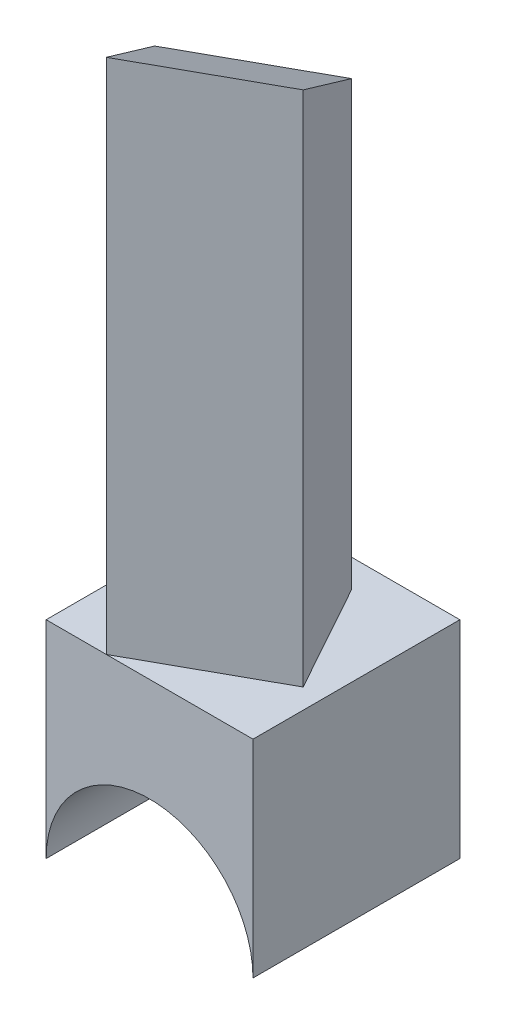
ISO-10303-21;
HEADER;
FILE_DESCRIPTION(('STEP AP214'),'2;1');
FILE_NAME('part.step','',(''),(''),'','','');
FILE_SCHEMA(('AUTOMOTIVE_DESIGN { 1 0 10303 214 1 1 1 1 }'));
ENDSEC;
DATA;
#1=APPLICATION_CONTEXT('core data for automotive mechanical design processes');
#2=APPLICATION_PROTOCOL_DEFINITION('international standard','automotive_design',2000,#1);
#3=PRODUCT_CONTEXT('',#1,'mechanical');
#4=PRODUCT('Part','Part','',(#3));
#5=PRODUCT_RELATED_PRODUCT_CATEGORY('part','',(#4));
#6=PRODUCT_DEFINITION_FORMATION('','',#4);
#7=PRODUCT_DEFINITION_CONTEXT('part definition',#1,'design');
#8=PRODUCT_DEFINITION('design','',#6,#7);
#9=PRODUCT_DEFINITION_SHAPE('','',#8);
#10=(LENGTH_UNIT() NAMED_UNIT(*) SI_UNIT(.MILLI.,.METRE.));
#11=(NAMED_UNIT(*) PLANE_ANGLE_UNIT() SI_UNIT($,.RADIAN.));
#12=(NAMED_UNIT(*) SI_UNIT($,.STERADIAN.) SOLID_ANGLE_UNIT());
#13=UNCERTAINTY_MEASURE_WITH_UNIT(LENGTH_MEASURE(1.E-05),#10,'distance_accuracy_value','');
#14=(GEOMETRIC_REPRESENTATION_CONTEXT(3) GLOBAL_UNCERTAINTY_ASSIGNED_CONTEXT((#13)) GLOBAL_UNIT_ASSIGNED_CONTEXT((#10,
#11,#12)) REPRESENTATION_CONTEXT('',''));
#15=CARTESIAN_POINT('',(0.,0.,0.));
#16=DIRECTION('',(0.,0.,1.));
#17=DIRECTION('',(1.,0.,0.));
#18=AXIS2_PLACEMENT_3D('',#15,#16,#17);
#19=CARTESIAN_POINT('',(-50.,50.,-100.));
#20=DIRECTION('',(0.,-1.,0.));
#21=DIRECTION('',(0.,0.,1.));
#22=AXIS2_PLACEMENT_3D('',#19,#20,#21);
#23=PLANE('',#22);
#24=DIRECTION('',(0.484809620246331,0.,0.874619707139399));
#25=VECTOR('',#24,1.);
#26=CARTESIAN_POINT('',(40.3119567145378,50.,-33.9366734172432));
#27=LINE('',#26,#25);
#28=CARTESIAN_POINT('',(11.223379499758,50.,-86.4138558456071));
#29=VERTEX_POINT('',#28);
#30=CARTESIAN_POINT('',(40.3119567145378,50.,-33.9366734172432));
#31=VERTEX_POINT('',#30);
#32=EDGE_CURVE('E111',#29,#31,#27,.T.);
#33=ORIENTED_EDGE('',*,*,#32,.T.);
#34=DIRECTION('',(-0.874619707139399,0.,0.484809620246332));
#35=VECTOR('',#34,1.);
#36=CARTESIAN_POINT('',(-20.9114227852201,50.,0.));
#37=LINE('',#36,#35);
#38=CARTESIAN_POINT('',(-20.9114227852201,50.,0.));
#39=VERTEX_POINT('',#38);
#40=EDGE_CURVE('E167',#31,#39,#37,.T.);
#41=ORIENTED_EDGE('',*,*,#40,.T.);
#42=DIRECTION('',(-1.,0.,0.));
#43=VECTOR('',#42,1.);
#44=CARTESIAN_POINT('',(-50.,50.,0.));
#45=LINE('',#44,#43);
#46=CARTESIAN_POINT('',(50.,50.,0.));
#47=VERTEX_POINT('',#46);
#48=EDGE_CURVE('E149',#47,#39,#45,.T.);
#49=ORIENTED_EDGE('',*,*,#48,.F.);
#50=DIRECTION('',(0.,0.,1.));
#51=VECTOR('',#50,1.);
#52=CARTESIAN_POINT('',(50.,50.,-100.));
#53=LINE('',#52,#51);
#54=CARTESIAN_POINT('',(50.,50.,-100.));
#55=VERTEX_POINT('',#54);
#56=EDGE_CURVE('E45',#55,#47,#53,.T.);
#57=ORIENTED_EDGE('',*,*,#56,.F.);
#58=DIRECTION('',(-1.,0.,0.));
#59=VECTOR('',#58,1.);
#60=CARTESIAN_POINT('',(-50.,50.,-100.));
#61=LINE('',#60,#59);
#62=CARTESIAN_POINT('',(-50.,50.,-100.));
#63=VERTEX_POINT('',#62);
#64=EDGE_CURVE('E138',#55,#63,#61,.T.);
#65=ORIENTED_EDGE('',*,*,#64,.T.);
#66=DIRECTION('',(0.,0.,1.));
#67=VECTOR('',#66,1.);
#68=CARTESIAN_POINT('',(-50.,50.,-100.));
#69=LINE('',#68,#67);
#70=CARTESIAN_POINT('',(-50.,50.,-52.477182428364));
#71=VERTEX_POINT('',#70);
#72=EDGE_CURVE('E156',#63,#71,#69,.T.);
#73=ORIENTED_EDGE('',*,*,#72,.T.);
#74=DIRECTION('',(0.874619707139399,0.,-0.484809620246331));
#75=VECTOR('',#74,1.);
#76=CARTESIAN_POINT('',(11.223379499758,50.,-86.4138558456071));
#77=LINE('',#76,#75);
#78=EDGE_CURVE('E122',#71,#29,#77,.T.);
#79=ORIENTED_EDGE('',*,*,#78,.T.);
#80=EDGE_LOOP('',(#33,#41,#49,#57,#65,#73,#79));
#81=FACE_BOUND('',#80,.T.);
#82=ADVANCED_FACE('F37',(#81),#23,.F.);
#83=DIRECTION('',(-0.484809620246331,0.,-0.874619707139399));
#84=VECTOR('',#83,1.);
#85=CARTESIAN_POINT('',(-20.9114227852201,50.,0.));
#86=LINE('',#85,#84);
#87=EDGE_CURVE('E184',#39,#71,#86,.T.);
#88=ORIENTED_EDGE('',*,*,#87,.T.);
#89=CARTESIAN_POINT('',(-50.,50.,0.));
#90=VERTEX_POINT('',#89);
#91=EDGE_CURVE('E155',#71,#90,#69,.T.);
#92=ORIENTED_EDGE('',*,*,#91,.T.);
#93=EDGE_CURVE('E148',#39,#90,#45,.T.);
#94=ORIENTED_EDGE('',*,*,#93,.F.);
#95=EDGE_LOOP('',(#88,#92,#94));
#96=FACE_BOUND('',#95,.T.);
#97=ADVANCED_FACE('F185',(#96),#23,.F.);
#98=CARTESIAN_POINT('',(0.,-50.,-100.));
#99=DIRECTION('',(0.,0.,1.));
#100=DIRECTION('',(-1.,0.,0.));
#101=AXIS2_PLACEMENT_3D('',#98,#99,#100);
#102=CYLINDRICAL_SURFACE('',#101,50.);
#103=CARTESIAN_POINT('',(0.,-50.,0.));
#104=DIRECTION('',(0.,0.,-1.));
#105=DIRECTION('',(1.,0.,0.));
#106=AXIS2_PLACEMENT_3D('',#103,#104,#105);
#107=CIRCLE('',#106,50.);
#108=CARTESIAN_POINT('',(-50.,-50.,0.));
#109=VERTEX_POINT('',#108);
#110=CARTESIAN_POINT('',(50.,-50.,0.));
#111=VERTEX_POINT('',#110);
#112=EDGE_CURVE('E131',#109,#111,#107,.T.);
#113=ORIENTED_EDGE('',*,*,#112,.F.);
#114=DIRECTION('',(0.,0.,1.));
#115=VECTOR('',#114,1.);
#116=CARTESIAN_POINT('',(-50.,-50.,-100.));
#117=LINE('',#116,#115);
#118=CARTESIAN_POINT('',(-50.,-50.,-100.));
#119=VERTEX_POINT('',#118);
#120=EDGE_CURVE('E143',#119,#109,#117,.T.);
#121=ORIENTED_EDGE('',*,*,#120,.F.);
#122=CARTESIAN_POINT('',(0.,-50.,-100.));
#123=DIRECTION('',(0.,0.,-1.));
#124=DIRECTION('',(1.,0.,0.));
#125=AXIS2_PLACEMENT_3D('',#122,#123,#124);
#126=CIRCLE('',#125,50.);
#127=CARTESIAN_POINT('',(50.,-50.,-100.));
#128=VERTEX_POINT('',#127);
#129=EDGE_CURVE('E132',#119,#128,#126,.T.);
#130=ORIENTED_EDGE('',*,*,#129,.T.);
#131=DIRECTION('',(0.,0.,1.));
#132=VECTOR('',#131,1.);
#133=CARTESIAN_POINT('',(50.,-50.,-100.));
#134=LINE('',#133,#132);
#135=EDGE_CURVE('E11',#128,#111,#134,.T.);
#136=ORIENTED_EDGE('',*,*,#135,.T.);
#137=EDGE_LOOP('',(#113,#121,#130,#136));
#138=FACE_BOUND('',#137,.T.);
#139=ADVANCED_FACE('F39',(#138),#102,.F.);
#140=CARTESIAN_POINT('',(50.,50.,-100.));
#141=DIRECTION('',(-1.,0.,0.));
#142=DIRECTION('',(0.,-1.,0.));
#143=AXIS2_PLACEMENT_3D('',#140,#141,#142);
#144=PLANE('',#143);
#145=DIRECTION('',(0.,1.,0.));
#146=VECTOR('',#145,1.);
#147=CARTESIAN_POINT('',(50.,50.,0.));
#148=LINE('',#147,#146);
#149=EDGE_CURVE('E146',#111,#47,#148,.T.);
#150=ORIENTED_EDGE('',*,*,#149,.F.);
#151=ORIENTED_EDGE('',*,*,#135,.F.);
#152=DIRECTION('',(0.,1.,0.));
#153=VECTOR('',#152,1.);
#154=CARTESIAN_POINT('',(50.,50.,-100.));
#155=LINE('',#154,#153);
#156=EDGE_CURVE('E135',#128,#55,#155,.T.);
#157=ORIENTED_EDGE('',*,*,#156,.T.);
#158=ORIENTED_EDGE('',*,*,#56,.T.);
#159=EDGE_LOOP('',(#150,#151,#157,#158));
#160=FACE_BOUND('',#159,.T.);
#161=ADVANCED_FACE('F161',(#160),#144,.F.);
#162=CARTESIAN_POINT('',(-50.,50.,-100.));
#163=DIRECTION('',(1.,0.,0.));
#164=DIRECTION('',(0.,1.,0.));
#165=AXIS2_PLACEMENT_3D('',#162,#163,#164);
#166=PLANE('',#165);
#167=DIRECTION('',(0.,-1.,0.));
#168=VECTOR('',#167,1.);
#169=CARTESIAN_POINT('',(-50.,50.,0.));
#170=LINE('',#169,#168);
#171=EDGE_CURVE('E136',#90,#109,#170,.T.);
#172=ORIENTED_EDGE('',*,*,#171,.F.);
#173=ORIENTED_EDGE('',*,*,#91,.F.);
#174=ORIENTED_EDGE('',*,*,#72,.F.);
#175=DIRECTION('',(0.,-1.,0.));
#176=VECTOR('',#175,1.);
#177=CARTESIAN_POINT('',(-50.,50.,-100.));
#178=LINE('',#177,#176);
#179=EDGE_CURVE('E141',#63,#119,#178,.T.);
#180=ORIENTED_EDGE('',*,*,#179,.T.);
#181=ORIENTED_EDGE('',*,*,#120,.T.);
#182=EDGE_LOOP('',(#172,#173,#174,#180,#181));
#183=FACE_BOUND('',#182,.T.);
#184=ADVANCED_FACE('F181',(#183),#166,.F.);
#185=CARTESIAN_POINT('',(0.,-50.,-100.));
#186=DIRECTION('',(0.,0.,-1.));
#187=DIRECTION('',(1.,0.,0.));
#188=AXIS2_PLACEMENT_3D('',#185,#186,#187);
#189=PLANE('',#188);
#190=ORIENTED_EDGE('',*,*,#129,.F.);
#191=ORIENTED_EDGE('',*,*,#179,.F.);
#192=ORIENTED_EDGE('',*,*,#64,.F.);
#193=ORIENTED_EDGE('',*,*,#156,.F.);
#194=EDGE_LOOP('',(#190,#191,#192,#193));
#195=FACE_BOUND('',#194,.T.);
#196=ADVANCED_FACE('F178',(#195),#189,.T.);
#197=CARTESIAN_POINT('',(0.,-50.,0.));
#198=DIRECTION('',(0.,0.,-1.));
#199=DIRECTION('',(1.,0.,0.));
#200=AXIS2_PLACEMENT_3D('',#197,#198,#199);
#201=PLANE('',#200);
#202=ORIENTED_EDGE('',*,*,#112,.T.);
#203=ORIENTED_EDGE('',*,*,#149,.T.);
#204=ORIENTED_EDGE('',*,*,#48,.T.);
#205=ORIENTED_EDGE('',*,*,#93,.T.);
#206=ORIENTED_EDGE('',*,*,#171,.T.);
#207=EDGE_LOOP('',(#202,#203,#204,#205,#206));
#208=FACE_BOUND('',#207,.T.);
#209=ADVANCED_FACE('F170',(#208),#201,.F.);
#210=CARTESIAN_POINT('',(40.3119567145378,300.,-33.9366734172432));
#211=DIRECTION('',(-0.874619707139399,0.,0.484809620246331));
#212=DIRECTION('',(-0.484809620246331,0.,-0.874619707139399));
#213=AXIS2_PLACEMENT_3D('',#210,#211,#212);
#214=PLANE('',#213);
#215=DIRECTION('',(0.,-1.,0.));
#216=VECTOR('',#215,1.);
#217=CARTESIAN_POINT('',(40.3119567145378,300.,-33.9366734172432));
#218=LINE('',#217,#216);
#219=CARTESIAN_POINT('',(40.3119567145378,300.,-33.9366734172432));
#220=VERTEX_POINT('',#219);
#221=EDGE_CURVE('E60',#220,#31,#218,.T.);
#222=ORIENTED_EDGE('',*,*,#221,.T.);
#223=ORIENTED_EDGE('',*,*,#32,.F.);
#224=DIRECTION('',(0.,-1.,0.));
#225=VECTOR('',#224,1.);
#226=CARTESIAN_POINT('',(11.223379499758,300.,-86.4138558456071));
#227=LINE('',#226,#225);
#228=CARTESIAN_POINT('',(11.2233794997579,263.948362858347,-86.4138558456071));
#229=VERTEX_POINT('',#228);
#230=EDGE_CURVE('E52',#229,#29,#227,.T.);
#231=ORIENTED_EDGE('',*,*,#230,.F.);
#232=DIRECTION('',(0.415562953540966,0.515038074910049,0.749695413509553));
#233=VECTOR('',#232,1.);
#234=CARTESIAN_POINT('',(40.3119567145378,300.,-33.9366734172431));
#235=LINE('',#234,#233);
#236=EDGE_CURVE('E109',#229,#220,#235,.T.);
#237=ORIENTED_EDGE('',*,*,#236,.T.);
#238=EDGE_LOOP('',(#222,#223,#231,#237));
#239=FACE_BOUND('',#238,.T.);
#240=ADVANCED_FACE('F191',(#239),#214,.F.);
#241=CARTESIAN_POINT('',(-20.9114227852201,300.,0.));
#242=DIRECTION('',(-0.484809620246332,0.,-0.874619707139399));
#243=DIRECTION('',(0.874619707139399,0.,-0.484809620246332));
#244=AXIS2_PLACEMENT_3D('',#241,#242,#243);
#245=PLANE('',#244);
#246=ORIENTED_EDGE('',*,*,#40,.F.);
#247=ORIENTED_EDGE('',*,*,#221,.F.);
#248=DIRECTION('',(-0.874619707139399,0.,0.484809620246332));
#249=VECTOR('',#248,1.);
#250=CARTESIAN_POINT('',(-20.9114227852201,300.,0.));
#251=LINE('',#250,#249);
#252=CARTESIAN_POINT('',(-20.9114227852201,300.,0.));
#253=VERTEX_POINT('',#252);
#254=EDGE_CURVE('E126',#220,#253,#251,.T.);
#255=ORIENTED_EDGE('',*,*,#254,.T.);
#256=DIRECTION('',(0.,-1.,0.));
#257=VECTOR('',#256,1.);
#258=CARTESIAN_POINT('',(-20.9114227852201,300.,0.));
#259=LINE('',#258,#257);
#260=EDGE_CURVE('E118',#253,#39,#259,.T.);
#261=ORIENTED_EDGE('',*,*,#260,.T.);
#262=EDGE_LOOP('',(#246,#247,#255,#261));
#263=FACE_BOUND('',#262,.T.);
#264=ADVANCED_FACE('F193',(#263),#245,.F.);
#265=CARTESIAN_POINT('',(-20.9114227852201,300.,0.));
#266=DIRECTION('',(0.874619707139399,0.,-0.484809620246331));
#267=DIRECTION('',(0.484809620246331,0.,0.874619707139399));
#268=AXIS2_PLACEMENT_3D('',#265,#266,#267);
#269=PLANE('',#268);
#270=DIRECTION('',(0.,-1.,0.));
#271=VECTOR('',#270,1.);
#272=CARTESIAN_POINT('',(-50.,300.,-52.4771824283639));
#273=LINE('',#272,#271);
#274=CARTESIAN_POINT('',(-50.,263.948362858347,-52.4771824283638));
#275=VERTEX_POINT('',#274);
#276=EDGE_CURVE('E116',#275,#71,#273,.T.);
#277=ORIENTED_EDGE('',*,*,#276,.T.);
#278=ORIENTED_EDGE('',*,*,#87,.F.);
#279=ORIENTED_EDGE('',*,*,#260,.F.);
#280=DIRECTION('',(0.415562953540966,0.515038074910049,0.749695413509553));
#281=VECTOR('',#280,1.);
#282=CARTESIAN_POINT('',(-20.9114227852201,300.,0.));
#283=LINE('',#282,#281);
#284=EDGE_CURVE('E107',#275,#253,#283,.T.);
#285=ORIENTED_EDGE('',*,*,#284,.F.);
#286=EDGE_LOOP('',(#277,#278,#279,#285));
#287=FACE_BOUND('',#286,.T.);
#288=ADVANCED_FACE('F114',(#287),#269,.F.);
#289=CARTESIAN_POINT('',(11.223379499758,300.,-86.4138558456071));
#290=DIRECTION('',(0.484809620246331,0.,0.874619707139399));
#291=DIRECTION('',(-0.874619707139399,0.,0.484809620246331));
#292=AXIS2_PLACEMENT_3D('',#289,#290,#291);
#293=PLANE('',#292);
#294=ORIENTED_EDGE('',*,*,#230,.T.);
#295=ORIENTED_EDGE('',*,*,#78,.F.);
#296=ORIENTED_EDGE('',*,*,#276,.F.);
#297=DIRECTION('',(0.874619707139399,0.,-0.484809620246332));
#298=VECTOR('',#297,1.);
#299=CARTESIAN_POINT('',(-50.,263.948362858347,-52.4771824283638));
#300=LINE('',#299,#298);
#301=EDGE_CURVE('E104',#275,#229,#300,.T.);
#302=ORIENTED_EDGE('',*,*,#301,.T.);
#303=EDGE_LOOP('',(#294,#295,#296,#302));
#304=FACE_BOUND('',#303,.T.);
#305=ADVANCED_FACE('F121',(#304),#293,.F.);
#306=CARTESIAN_POINT('',(-20.9114227852201,300.,0.));
#307=DIRECTION('',(0.249695413509543,-0.857167300702115,0.450462450243467));
#308=DIRECTION('',(0.,0.465197857857139,0.885206728987714));
#309=AXIS2_PLACEMENT_3D('',#306,#307,#308);
#310=PLANE('',#309);
#311=ORIENTED_EDGE('',*,*,#236,.F.);
#312=ORIENTED_EDGE('',*,*,#301,.F.);
#313=ORIENTED_EDGE('',*,*,#284,.T.);
#314=ORIENTED_EDGE('',*,*,#254,.F.);
#315=EDGE_LOOP('',(#311,#312,#313,#314));
#316=FACE_BOUND('',#315,.T.);
#317=ADVANCED_FACE('F106',(#316),#310,.F.);
#318=CLOSED_SHELL('',(#82,#97,#139,#161,#184,#196,#209,#240,#264,#288,#305,#317));
#319=MANIFOLD_SOLID_BREP('B2',#318);
#320=ADVANCED_BREP_SHAPE_REPRESENTATION('',(#18,#319),#14);
#321=SHAPE_DEFINITION_REPRESENTATION(#9,#320);
ENDSEC;
END-ISO-10303-21;
